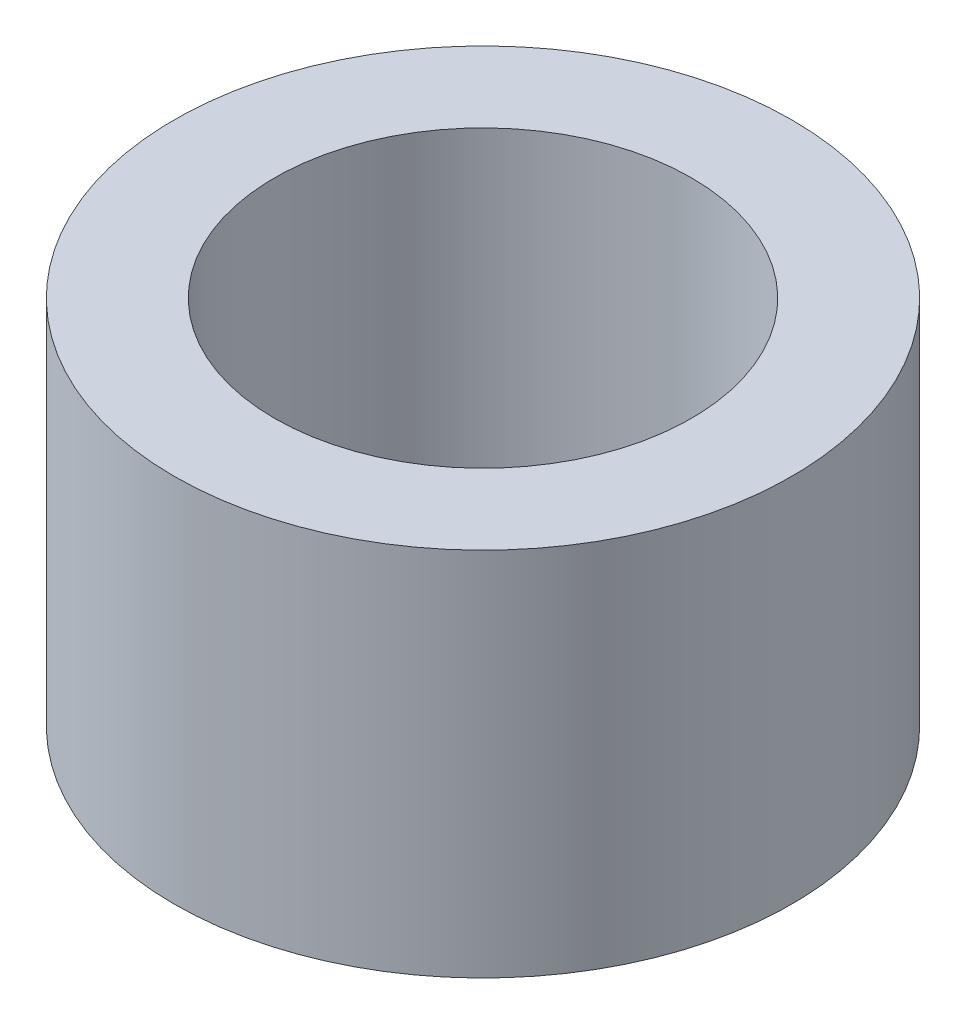
ISO-10303-21;
HEADER;
FILE_DESCRIPTION(('STEP AP214'),'2;1');
FILE_NAME('part.step','',(''),(''),'','','');
FILE_SCHEMA(('AUTOMOTIVE_DESIGN { 1 0 10303 214 1 1 1 1 }'));
ENDSEC;
DATA;
#1=APPLICATION_CONTEXT('core data for automotive mechanical design processes');
#2=APPLICATION_PROTOCOL_DEFINITION('international standard','automotive_design',2000,#1);
#3=PRODUCT_CONTEXT('',#1,'mechanical');
#4=PRODUCT('Part','Part','',(#3));
#5=PRODUCT_RELATED_PRODUCT_CATEGORY('part','',(#4));
#6=PRODUCT_DEFINITION_FORMATION('','',#4);
#7=PRODUCT_DEFINITION_CONTEXT('part definition',#1,'design');
#8=PRODUCT_DEFINITION('design','',#6,#7);
#9=PRODUCT_DEFINITION_SHAPE('','',#8);
#10=(LENGTH_UNIT() NAMED_UNIT(*) SI_UNIT(.MILLI.,.METRE.));
#11=(NAMED_UNIT(*) PLANE_ANGLE_UNIT() SI_UNIT($,.RADIAN.));
#12=(NAMED_UNIT(*) SI_UNIT($,.STERADIAN.) SOLID_ANGLE_UNIT());
#13=UNCERTAINTY_MEASURE_WITH_UNIT(LENGTH_MEASURE(1.E-05),#10,'distance_accuracy_value','');
#14=(GEOMETRIC_REPRESENTATION_CONTEXT(3) GLOBAL_UNCERTAINTY_ASSIGNED_CONTEXT((#13)) GLOBAL_UNIT_ASSIGNED_CONTEXT((#10,
#11,#12)) REPRESENTATION_CONTEXT('',''));
#15=CARTESIAN_POINT('',(0.,0.,0.));
#16=DIRECTION('',(0.,0.,1.));
#17=DIRECTION('',(1.,0.,0.));
#18=AXIS2_PLACEMENT_3D('',#15,#16,#17);
#19=CARTESIAN_POINT('',(0.,6.096,0.));
#20=DIRECTION('',(0.,1.,0.));
#21=DIRECTION('',(0.,0.,1.));
#22=AXIS2_PLACEMENT_3D('',#19,#20,#21);
#23=PLANE('',#22);
#24=CARTESIAN_POINT('',(0.,6.096,0.));
#25=DIRECTION('',(0.,1.,0.));
#26=DIRECTION('',(0.,0.,1.));
#27=AXIS2_PLACEMENT_3D('',#24,#25,#26);
#28=CIRCLE('',#27,5.08);
#29=CARTESIAN_POINT('',(0.,6.096,-5.08));
#30=VERTEX_POINT('',#29);
#31=EDGE_CURVE('E10',#30,#30,#28,.T.);
#32=ORIENTED_EDGE('',*,*,#31,.T.);
#33=EDGE_LOOP('',(#32));
#34=FACE_BOUND('',#33,.T.);
#35=CARTESIAN_POINT('',(0.,6.096,0.));
#36=DIRECTION('',(0.,1.,0.));
#37=DIRECTION('',(0.,0.,1.));
#38=AXIS2_PLACEMENT_3D('',#35,#36,#37);
#39=CIRCLE('',#38,3.429);
#40=CARTESIAN_POINT('',(0.,6.096,-3.429));
#41=VERTEX_POINT('',#40);
#42=EDGE_CURVE('E46',#41,#41,#39,.T.);
#43=ORIENTED_EDGE('',*,*,#42,.F.);
#44=EDGE_LOOP('',(#43));
#45=FACE_BOUND('',#44,.T.);
#46=ADVANCED_FACE('F35',(#34,#45),#23,.T.);
#47=CARTESIAN_POINT('',(0.,0.,0.));
#48=DIRECTION('',(0.,1.,0.));
#49=DIRECTION('',(0.,0.,1.));
#50=AXIS2_PLACEMENT_3D('',#47,#48,#49);
#51=PLANE('',#50);
#52=CARTESIAN_POINT('',(0.,0.,0.));
#53=DIRECTION('',(0.,1.,0.));
#54=DIRECTION('',(0.,0.,1.));
#55=AXIS2_PLACEMENT_3D('',#52,#53,#54);
#56=CIRCLE('',#55,5.08);
#57=CARTESIAN_POINT('',(0.,0.,-5.08));
#58=VERTEX_POINT('',#57);
#59=EDGE_CURVE('E39',#58,#58,#56,.T.);
#60=ORIENTED_EDGE('',*,*,#59,.F.);
#61=EDGE_LOOP('',(#60));
#62=FACE_BOUND('',#61,.T.);
#63=CARTESIAN_POINT('',(0.,0.,0.));
#64=DIRECTION('',(0.,1.,0.));
#65=DIRECTION('',(0.,0.,1.));
#66=AXIS2_PLACEMENT_3D('',#63,#64,#65);
#67=CIRCLE('',#66,3.429);
#68=CARTESIAN_POINT('',(0.,0.,-3.429));
#69=VERTEX_POINT('',#68);
#70=EDGE_CURVE('E48',#69,#69,#67,.T.);
#71=ORIENTED_EDGE('',*,*,#70,.T.);
#72=EDGE_LOOP('',(#71));
#73=FACE_BOUND('',#72,.T.);
#74=ADVANCED_FACE('F58',(#62,#73),#51,.F.);
#75=CARTESIAN_POINT('',(0.,6.096,0.));
#76=DIRECTION('',(0.,-1.,0.));
#77=DIRECTION('',(0.,0.,-1.));
#78=AXIS2_PLACEMENT_3D('',#75,#76,#77);
#79=CYLINDRICAL_SURFACE('',#78,5.08);
#80=CARTESIAN_POINT('',(0.,6.096,-5.08));
#81=CARTESIAN_POINT('',(0.,6.0325,-5.08));
#82=CARTESIAN_POINT('',(0.,5.969,-5.08));
#83=CARTESIAN_POINT('',(0.,5.842,-5.08));
#84=CARTESIAN_POINT('',(0.,5.7785,-5.08));
#85=CARTESIAN_POINT('',(0.,5.6515,-5.08));
#86=CARTESIAN_POINT('',(0.,5.588,-5.08));
#87=CARTESIAN_POINT('',(0.,5.461,-5.08));
#88=CARTESIAN_POINT('',(0.,5.3975,-5.08));
#89=CARTESIAN_POINT('',(0.,5.2705,-5.08));
#90=CARTESIAN_POINT('',(0.,5.207,-5.08));
#91=CARTESIAN_POINT('',(0.,5.08,-5.08));
#92=CARTESIAN_POINT('',(0.,5.0165,-5.08));
#93=CARTESIAN_POINT('',(0.,4.8895,-5.08));
#94=CARTESIAN_POINT('',(0.,4.826,-5.08));
#95=CARTESIAN_POINT('',(0.,4.699,-5.08));
#96=CARTESIAN_POINT('',(0.,4.6355,-5.08));
#97=CARTESIAN_POINT('',(0.,4.5085,-5.08));
#98=CARTESIAN_POINT('',(0.,4.445,-5.08));
#99=CARTESIAN_POINT('',(0.,4.318,-5.08));
#100=CARTESIAN_POINT('',(0.,4.2545,-5.08));
#101=CARTESIAN_POINT('',(0.,4.1275,-5.08));
#102=CARTESIAN_POINT('',(0.,4.064,-5.08));
#103=CARTESIAN_POINT('',(0.,3.937,-5.08));
#104=CARTESIAN_POINT('',(0.,3.8735,-5.08));
#105=CARTESIAN_POINT('',(0.,3.7465,-5.08));
#106=CARTESIAN_POINT('',(0.,3.683,-5.08));
#107=CARTESIAN_POINT('',(0.,3.556,-5.08));
#108=CARTESIAN_POINT('',(0.,3.4925,-5.08));
#109=CARTESIAN_POINT('',(0.,3.3655,-5.08));
#110=CARTESIAN_POINT('',(0.,3.302,-5.08));
#111=CARTESIAN_POINT('',(0.,3.175,-5.08));
#112=CARTESIAN_POINT('',(0.,3.1115,-5.08));
#113=CARTESIAN_POINT('',(0.,2.9845,-5.08));
#114=CARTESIAN_POINT('',(0.,2.921,-5.08));
#115=CARTESIAN_POINT('',(0.,2.794,-5.08));
#116=CARTESIAN_POINT('',(0.,2.7305,-5.08));
#117=CARTESIAN_POINT('',(0.,2.6035,-5.08));
#118=CARTESIAN_POINT('',(0.,2.54,-5.08));
#119=CARTESIAN_POINT('',(0.,2.413,-5.08));
#120=CARTESIAN_POINT('',(0.,2.3495,-5.08));
#121=CARTESIAN_POINT('',(0.,2.2225,-5.08));
#122=CARTESIAN_POINT('',(0.,2.159,-5.08));
#123=CARTESIAN_POINT('',(0.,2.032,-5.08));
#124=CARTESIAN_POINT('',(0.,1.9685,-5.08));
#125=CARTESIAN_POINT('',(0.,1.8415,-5.08));
#126=CARTESIAN_POINT('',(0.,1.778,-5.08));
#127=CARTESIAN_POINT('',(0.,1.651,-5.08));
#128=CARTESIAN_POINT('',(0.,1.5875,-5.08));
#129=CARTESIAN_POINT('',(0.,1.4605,-5.08));
#130=CARTESIAN_POINT('',(0.,1.397,-5.08));
#131=CARTESIAN_POINT('',(0.,1.27,-5.08));
#132=CARTESIAN_POINT('',(0.,1.2065,-5.08));
#133=CARTESIAN_POINT('',(0.,1.0795,-5.08));
#134=CARTESIAN_POINT('',(0.,1.016,-5.08));
#135=CARTESIAN_POINT('',(0.,0.889,-5.08));
#136=CARTESIAN_POINT('',(0.,0.8255,-5.08));
#137=CARTESIAN_POINT('',(0.,0.6985,-5.08));
#138=CARTESIAN_POINT('',(0.,0.635,-5.08));
#139=CARTESIAN_POINT('',(0.,0.508,-5.08));
#140=CARTESIAN_POINT('',(0.,0.4445,-5.08));
#141=CARTESIAN_POINT('',(0.,0.3175,-5.08));
#142=CARTESIAN_POINT('',(0.,0.254,-5.08));
#143=CARTESIAN_POINT('',(0.,0.127,-5.08));
#144=CARTESIAN_POINT('',(0.,0.0634999999999999,-5.08));
#145=CARTESIAN_POINT('',(0.,0.,-5.08));
#146=B_SPLINE_CURVE_WITH_KNOTS('',3,(#80,#81,#82,#83,#84,#85,#86,#87,#88,#89,#90,#91,#92,#93,
#94,#95,#96,#97,#98,#99,#100,#101,#102,#103,#104,#105,#106,#107,#108,#109,#110,#111,#112,#113,
#114,#115,#116,#117,#118,#119,#120,#121,#122,#123,#124,#125,#126,#127,#128,#129,#130,#131,#132,
#133,#134,#135,#136,#137,#138,#139,#140,#141,#142,#143,#144,#145),.UNSPECIFIED.,.F.,.F.,(4,2,2,
2,2,2,2,2,2,2,2,2,2,2,2,2,2,2,2,2,2,2,2,2,2,2,2,2,2,2,2,2,4),(0.,0.1905,0.380999999999999,
0.571499999999999,0.762,0.952499999999999,1.143,1.3335,1.524,1.7145,1.905,2.0955,2.286,2.4765,
2.667,2.8575,3.048,3.2385,3.429,3.6195,3.81,4.0005,4.191,4.3815,4.572,4.7625,4.953,5.1435,5.334,
5.5245,5.715,5.9055,6.096),.UNSPECIFIED.);
#147=EDGE_CURVE('BSEAM37',#30,#58,#146,.T.);
#148=ORIENTED_EDGE('',*,*,#31,.F.);
#149=ORIENTED_EDGE('',*,*,#59,.T.);
#150=ORIENTED_EDGE('',*,*,#147,.T.);
#151=ORIENTED_EDGE('',*,*,#147,.F.);
#152=EDGE_LOOP('',(#148,#150,#149,#151));
#153=FACE_BOUND('',#152,.T.);
#154=ADVANCED_FACE('F37',(#153),#79,.T.);
#155=CARTESIAN_POINT('',(0.,6.096,0.));
#156=DIRECTION('',(0.,-1.,0.));
#157=DIRECTION('',(0.,0.,-1.));
#158=AXIS2_PLACEMENT_3D('',#155,#156,#157);
#159=CYLINDRICAL_SURFACE('',#158,3.429);
#160=CARTESIAN_POINT('',(0.,6.096,-3.429));
#161=CARTESIAN_POINT('',(0.,6.0325,-3.429));
#162=CARTESIAN_POINT('',(0.,5.969,-3.429));
#163=CARTESIAN_POINT('',(0.,5.842,-3.429));
#164=CARTESIAN_POINT('',(0.,5.7785,-3.429));
#165=CARTESIAN_POINT('',(0.,5.6515,-3.429));
#166=CARTESIAN_POINT('',(0.,5.588,-3.429));
#167=CARTESIAN_POINT('',(0.,5.461,-3.429));
#168=CARTESIAN_POINT('',(0.,5.3975,-3.429));
#169=CARTESIAN_POINT('',(0.,5.2705,-3.429));
#170=CARTESIAN_POINT('',(0.,5.207,-3.429));
#171=CARTESIAN_POINT('',(0.,5.08,-3.429));
#172=CARTESIAN_POINT('',(0.,5.0165,-3.429));
#173=CARTESIAN_POINT('',(0.,4.8895,-3.429));
#174=CARTESIAN_POINT('',(0.,4.826,-3.429));
#175=CARTESIAN_POINT('',(0.,4.699,-3.429));
#176=CARTESIAN_POINT('',(0.,4.6355,-3.429));
#177=CARTESIAN_POINT('',(0.,4.5085,-3.429));
#178=CARTESIAN_POINT('',(0.,4.445,-3.429));
#179=CARTESIAN_POINT('',(0.,4.318,-3.429));
#180=CARTESIAN_POINT('',(0.,4.2545,-3.429));
#181=CARTESIAN_POINT('',(0.,4.1275,-3.429));
#182=CARTESIAN_POINT('',(0.,4.064,-3.429));
#183=CARTESIAN_POINT('',(0.,3.937,-3.429));
#184=CARTESIAN_POINT('',(0.,3.8735,-3.429));
#185=CARTESIAN_POINT('',(0.,3.7465,-3.429));
#186=CARTESIAN_POINT('',(0.,3.683,-3.429));
#187=CARTESIAN_POINT('',(0.,3.556,-3.429));
#188=CARTESIAN_POINT('',(0.,3.4925,-3.429));
#189=CARTESIAN_POINT('',(0.,3.3655,-3.429));
#190=CARTESIAN_POINT('',(0.,3.302,-3.429));
#191=CARTESIAN_POINT('',(0.,3.175,-3.429));
#192=CARTESIAN_POINT('',(0.,3.1115,-3.429));
#193=CARTESIAN_POINT('',(0.,2.9845,-3.429));
#194=CARTESIAN_POINT('',(0.,2.921,-3.429));
#195=CARTESIAN_POINT('',(0.,2.794,-3.429));
#196=CARTESIAN_POINT('',(0.,2.7305,-3.429));
#197=CARTESIAN_POINT('',(0.,2.6035,-3.429));
#198=CARTESIAN_POINT('',(0.,2.54,-3.429));
#199=CARTESIAN_POINT('',(0.,2.413,-3.429));
#200=CARTESIAN_POINT('',(0.,2.3495,-3.429));
#201=CARTESIAN_POINT('',(0.,2.2225,-3.429));
#202=CARTESIAN_POINT('',(0.,2.159,-3.429));
#203=CARTESIAN_POINT('',(0.,2.032,-3.429));
#204=CARTESIAN_POINT('',(0.,1.9685,-3.429));
#205=CARTESIAN_POINT('',(0.,1.8415,-3.429));
#206=CARTESIAN_POINT('',(0.,1.778,-3.429));
#207=CARTESIAN_POINT('',(0.,1.651,-3.429));
#208=CARTESIAN_POINT('',(0.,1.5875,-3.429));
#209=CARTESIAN_POINT('',(0.,1.4605,-3.429));
#210=CARTESIAN_POINT('',(0.,1.397,-3.429));
#211=CARTESIAN_POINT('',(0.,1.27,-3.429));
#212=CARTESIAN_POINT('',(0.,1.2065,-3.429));
#213=CARTESIAN_POINT('',(0.,1.0795,-3.429));
#214=CARTESIAN_POINT('',(0.,1.016,-3.429));
#215=CARTESIAN_POINT('',(0.,0.889,-3.429));
#216=CARTESIAN_POINT('',(0.,0.8255,-3.429));
#217=CARTESIAN_POINT('',(0.,0.6985,-3.429));
#218=CARTESIAN_POINT('',(0.,0.635,-3.429));
#219=CARTESIAN_POINT('',(0.,0.508,-3.429));
#220=CARTESIAN_POINT('',(0.,0.4445,-3.429));
#221=CARTESIAN_POINT('',(0.,0.3175,-3.429));
#222=CARTESIAN_POINT('',(0.,0.254,-3.429));
#223=CARTESIAN_POINT('',(0.,0.127,-3.429));
#224=CARTESIAN_POINT('',(0.,0.0634999999999999,-3.429));
#225=CARTESIAN_POINT('',(0.,0.,-3.429));
#226=B_SPLINE_CURVE_WITH_KNOTS('',3,(#160,#161,#162,#163,#164,#165,#166,#167,#168,#169,#170,
#171,#172,#173,#174,#175,#176,#177,#178,#179,#180,#181,#182,#183,#184,#185,#186,#187,#188,#189,
#190,#191,#192,#193,#194,#195,#196,#197,#198,#199,#200,#201,#202,#203,#204,#205,#206,#207,#208,
#209,#210,#211,#212,#213,#214,#215,#216,#217,#218,#219,#220,#221,#222,#223,#224,#225),
.UNSPECIFIED.,.F.,.F.,(4,2,2,2,2,2,2,2,2,2,2,2,2,2,2,2,2,2,2,2,2,2,2,2,2,2,2,2,2,2,2,2,4),(0.,
0.190500000000001,0.381,0.5715,0.762000000000001,0.9525,1.143,1.3335,1.524,1.7145,1.905,2.0955,
2.286,2.4765,2.667,2.8575,3.048,3.2385,3.429,3.6195,3.81,4.0005,4.191,4.3815,4.572,4.7625,4.953,
5.1435,5.334,5.5245,5.715,5.9055,6.096),.UNSPECIFIED.);
#227=EDGE_CURVE('BSEAM54',#41,#69,#226,.T.);
#228=ORIENTED_EDGE('',*,*,#42,.T.);
#229=ORIENTED_EDGE('',*,*,#70,.F.);
#230=ORIENTED_EDGE('',*,*,#227,.T.);
#231=ORIENTED_EDGE('',*,*,#227,.F.);
#232=EDGE_LOOP('',(#228,#230,#229,#231));
#233=FACE_BOUND('',#232,.T.);
#234=ADVANCED_FACE('F54',(#233),#159,.F.);
#235=CLOSED_SHELL('',(#46,#74,#154,#234));
#236=MANIFOLD_SOLID_BREP('B2',#235);
#237=ADVANCED_BREP_SHAPE_REPRESENTATION('',(#18,#236),#14);
#238=SHAPE_DEFINITION_REPRESENTATION(#9,#237);
ENDSEC;
END-ISO-10303-21;
